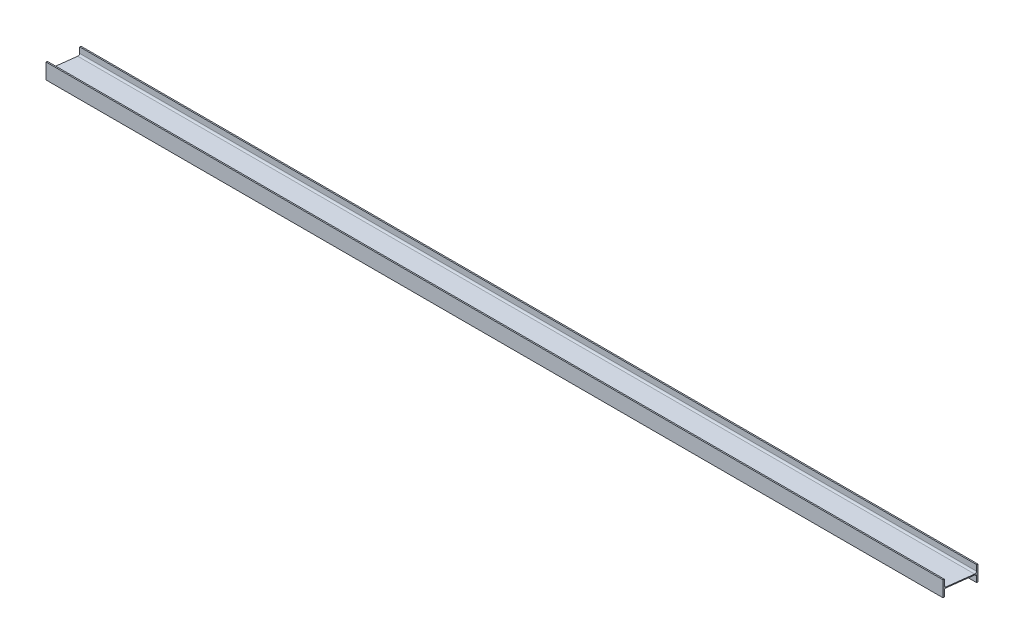
ISO-10303-21;
HEADER;
FILE_DESCRIPTION(('STEP AP214'),'2;1');
FILE_NAME('part.step','',(''),(''),'','','');
FILE_SCHEMA(('AUTOMOTIVE_DESIGN { 1 0 10303 214 1 1 1 1 }'));
ENDSEC;
DATA;
#1=APPLICATION_CONTEXT('core data for automotive mechanical design processes');
#2=APPLICATION_PROTOCOL_DEFINITION('international standard','automotive_design',2000,#1);
#3=PRODUCT_CONTEXT('',#1,'mechanical');
#4=PRODUCT('Part','Part','',(#3));
#5=PRODUCT_RELATED_PRODUCT_CATEGORY('part','',(#4));
#6=PRODUCT_DEFINITION_FORMATION('','',#4);
#7=PRODUCT_DEFINITION_CONTEXT('part definition',#1,'design');
#8=PRODUCT_DEFINITION('design','',#6,#7);
#9=PRODUCT_DEFINITION_SHAPE('','',#8);
#10=(LENGTH_UNIT() NAMED_UNIT(*) SI_UNIT(.MILLI.,.METRE.));
#11=(NAMED_UNIT(*) PLANE_ANGLE_UNIT() SI_UNIT($,.RADIAN.));
#12=(NAMED_UNIT(*) SI_UNIT($,.STERADIAN.) SOLID_ANGLE_UNIT());
#13=UNCERTAINTY_MEASURE_WITH_UNIT(LENGTH_MEASURE(1.E-05),#10,'distance_accuracy_value','');
#14=(GEOMETRIC_REPRESENTATION_CONTEXT(3) GLOBAL_UNCERTAINTY_ASSIGNED_CONTEXT((#13)) GLOBAL_UNIT_ASSIGNED_CONTEXT((#10,
#11,#12)) REPRESENTATION_CONTEXT('',''));
#15=CARTESIAN_POINT('',(0.,0.,0.));
#16=DIRECTION('',(0.,0.,1.));
#17=DIRECTION('',(1.,0.,0.));
#18=AXIS2_PLACEMENT_3D('',#15,#16,#17);
#19=CARTESIAN_POINT('',(5780.,13.7499999999998,-80.9999999999995));
#20=DIRECTION('',(-1.,0.,0.));
#21=DIRECTION('',(0.,0.,-1.));
#22=AXIS2_PLACEMENT_3D('',#19,#20,#21);
#23=CYLINDRICAL_SURFACE('',#22,11.);
#24=DIRECTION('',(-1.,0.,0.));
#25=VECTOR('',#24,1.);
#26=CARTESIAN_POINT('',(5780.,2.74999999999981,-80.9999999999995));
#27=LINE('',#26,#25);
#28=CARTESIAN_POINT('',(5777.625,2.74999999999981,-80.9999999999995));
#29=VERTEX_POINT('',#28);
#30=CARTESIAN_POINT('',(22.6249999999997,2.74999999999981,-80.9999999999995));
#31=VERTEX_POINT('',#30);
#32=EDGE_CURVE('E191',#29,#31,#27,.T.);
#33=ORIENTED_EDGE('',*,*,#32,.F.);
#34=CARTESIAN_POINT('',(5777.625,13.7499999999998,-80.9999999999995));
#35=DIRECTION('',(0.992277876713668,0.,0.12403473458921));
#36=DIRECTION('',(-0.12403473458921,0.,0.992277876713668));
#37=AXIS2_PLACEMENT_3D('',#34,#35,#36);
#38=ELLIPSE('',#37,11.0856044039105,11.);
#39=CARTESIAN_POINT('',(5779.,13.75,-92.0000000000005));
#40=VERTEX_POINT('',#39);
#41=EDGE_CURVE('E249',#40,#29,#38,.F.);
#42=ORIENTED_EDGE('',*,*,#41,.F.);
#43=DIRECTION('',(-1.,0.,0.));
#44=VECTOR('',#43,1.);
#45=CARTESIAN_POINT('',(5780.,13.75,-92.0000000000005));
#46=LINE('',#45,#44);
#47=CARTESIAN_POINT('',(24.,13.75,-92.0000000000005));
#48=VERTEX_POINT('',#47);
#49=EDGE_CURVE('E11',#40,#48,#46,.T.);
#50=ORIENTED_EDGE('',*,*,#49,.T.);
#51=CARTESIAN_POINT('',(22.6249999999997,13.7499999999998,-80.9999999999995));
#52=DIRECTION('',(-0.992277876713668,0.,-0.124034734589208));
#53=DIRECTION('',(-0.124034734589208,0.,0.992277876713668));
#54=AXIS2_PLACEMENT_3D('',#51,#52,#53);
#55=ELLIPSE('',#54,11.0856044039105,11.);
#56=EDGE_CURVE('E286',#31,#48,#55,.F.);
#57=ORIENTED_EDGE('',*,*,#56,.F.);
#58=EDGE_LOOP('',(#33,#42,#50,#57));
#59=FACE_BOUND('',#58,.T.);
#60=ADVANCED_FACE('F37',(#59),#23,.F.);
#61=CARTESIAN_POINT('',(5780.,50.,-92.0000000000005));
#62=DIRECTION('',(0.,0.,-1.));
#63=DIRECTION('',(0.,-1.,0.));
#64=AXIS2_PLACEMENT_3D('',#61,#62,#63);
#65=PLANE('',#64);
#66=ORIENTED_EDGE('',*,*,#49,.F.);
#67=DIRECTION('',(0.,-1.,0.));
#68=VECTOR('',#67,1.);
#69=CARTESIAN_POINT('',(5779.,50.,-92.0000000000005));
#70=LINE('',#69,#68);
#71=CARTESIAN_POINT('',(5779.,50.,-92.0000000000005));
#72=VERTEX_POINT('',#71);
#73=EDGE_CURVE('E252',#72,#40,#70,.T.);
#74=ORIENTED_EDGE('',*,*,#73,.F.);
#75=DIRECTION('',(-1.,0.,0.));
#76=VECTOR('',#75,1.);
#77=CARTESIAN_POINT('',(5780.,50.,-92.0000000000005));
#78=LINE('',#77,#76);
#79=CARTESIAN_POINT('',(24.,50.,-92.0000000000005));
#80=VERTEX_POINT('',#79);
#81=EDGE_CURVE('E46',#72,#80,#78,.T.);
#82=ORIENTED_EDGE('',*,*,#81,.T.);
#83=DIRECTION('',(0.,1.,0.));
#84=VECTOR('',#83,1.);
#85=CARTESIAN_POINT('',(24.,49.9999999999997,-92.0000000000005));
#86=LINE('',#85,#84);
#87=EDGE_CURVE('E163',#48,#80,#86,.T.);
#88=ORIENTED_EDGE('',*,*,#87,.F.);
#89=EDGE_LOOP('',(#66,#74,#82,#88));
#90=FACE_BOUND('',#89,.T.);
#91=ADVANCED_FACE('F337',(#90),#65,.F.);
#92=CARTESIAN_POINT('',(5780.,50.,-99.9999999999996));
#93=DIRECTION('',(0.,-1.,0.));
#94=DIRECTION('',(0.,0.,1.));
#95=AXIS2_PLACEMENT_3D('',#92,#93,#94);
#96=PLANE('',#95);
#97=ORIENTED_EDGE('',*,*,#81,.F.);
#98=DIRECTION('',(0.12403473458921,0.,-0.992277876713668));
#99=VECTOR('',#98,1.);
#100=CARTESIAN_POINT('',(5755.,50.,99.9999999999996));
#101=LINE('',#100,#99);
#102=CARTESIAN_POINT('',(5780.,50.,-99.9999999999996));
#103=VERTEX_POINT('',#102);
#104=EDGE_CURVE('E170',#72,#103,#101,.T.);
#105=ORIENTED_EDGE('',*,*,#104,.T.);
#106=DIRECTION('',(-1.,0.,0.));
#107=VECTOR('',#106,1.);
#108=CARTESIAN_POINT('',(5780.,50.,-99.9999999999996));
#109=LINE('',#108,#107);
#110=CARTESIAN_POINT('',(25.0000000000004,50.,-100.000000000001));
#111=VERTEX_POINT('',#110);
#112=EDGE_CURVE('E151',#103,#111,#109,.T.);
#113=ORIENTED_EDGE('',*,*,#112,.T.);
#114=DIRECTION('',(-0.124034734589208,0.,0.992277876713668));
#115=VECTOR('',#114,1.);
#116=CARTESIAN_POINT('',(0.,50.,99.9999999999996));
#117=LINE('',#116,#115);
#118=EDGE_CURVE('E158',#111,#80,#117,.T.);
#119=ORIENTED_EDGE('',*,*,#118,.T.);
#120=EDGE_LOOP('',(#97,#105,#113,#119));
#121=FACE_BOUND('',#120,.T.);
#122=ADVANCED_FACE('F169',(#121),#96,.F.);
#123=CARTESIAN_POINT('',(5780.,50.,-99.9999999999996));
#124=DIRECTION('',(0.,0.,1.));
#125=DIRECTION('',(0.,1.,0.));
#126=AXIS2_PLACEMENT_3D('',#123,#124,#125);
#127=PLANE('',#126);
#128=ORIENTED_EDGE('',*,*,#112,.F.);
#129=DIRECTION('',(0.,-1.,0.));
#130=VECTOR('',#129,1.);
#131=CARTESIAN_POINT('',(5780.,50.,-99.9999999999996));
#132=LINE('',#131,#130);
#133=CARTESIAN_POINT('',(5780.,-49.9999999999999,-99.9999999999996));
#134=VERTEX_POINT('',#133);
#135=EDGE_CURVE('E53',#103,#134,#132,.T.);
#136=ORIENTED_EDGE('',*,*,#135,.T.);
#137=DIRECTION('',(-1.,0.,0.));
#138=VECTOR('',#137,1.);
#139=CARTESIAN_POINT('',(5780.,-49.9999999999999,-99.9999999999996));
#140=LINE('',#139,#138);
#141=CARTESIAN_POINT('',(25.0000000000004,-49.9999999999999,-100.000000000001));
#142=VERTEX_POINT('',#141);
#143=EDGE_CURVE('E154',#134,#142,#140,.T.);
#144=ORIENTED_EDGE('',*,*,#143,.T.);
#145=DIRECTION('',(0.,1.,0.));
#146=VECTOR('',#145,1.);
#147=CARTESIAN_POINT('',(25.0000000000004,-50.000012,-100.000000000001));
#148=LINE('',#147,#146);
#149=EDGE_CURVE('E147',#142,#111,#148,.T.);
#150=ORIENTED_EDGE('',*,*,#149,.T.);
#151=EDGE_LOOP('',(#128,#136,#144,#150));
#152=FACE_BOUND('',#151,.T.);
#153=ADVANCED_FACE('F149',(#152),#127,.F.);
#154=CARTESIAN_POINT('',(5780.,-49.9999999999999,-99.9999999999996));
#155=DIRECTION('',(0.,1.,0.));
#156=DIRECTION('',(0.,0.,-1.));
#157=AXIS2_PLACEMENT_3D('',#154,#155,#156);
#158=PLANE('',#157);
#159=ORIENTED_EDGE('',*,*,#143,.F.);
#160=DIRECTION('',(0.12403473458921,0.,-0.992277876713668));
#161=VECTOR('',#160,1.);
#162=CARTESIAN_POINT('',(5780.,-49.9999999999999,-99.9999999999996));
#163=LINE('',#162,#161);
#164=CARTESIAN_POINT('',(5779.,-49.9999999999999,-92.0000000000005));
#165=VERTEX_POINT('',#164);
#166=EDGE_CURVE('E180',#165,#134,#163,.T.);
#167=ORIENTED_EDGE('',*,*,#166,.F.);
#168=DIRECTION('',(-1.,0.,0.));
#169=VECTOR('',#168,1.);
#170=CARTESIAN_POINT('',(5780.,-49.9999999999999,-92.0000000000005));
#171=LINE('',#170,#169);
#172=CARTESIAN_POINT('',(24.,-49.9999999999999,-92.0000000000005));
#173=VERTEX_POINT('',#172);
#174=EDGE_CURVE('E173',#165,#173,#171,.T.);
#175=ORIENTED_EDGE('',*,*,#174,.T.);
#176=DIRECTION('',(-0.124034734589208,0.,0.992277876713668));
#177=VECTOR('',#176,1.);
#178=CARTESIAN_POINT('',(113.538461538461,-50.,-808.307692307691));
#179=LINE('',#178,#177);
#180=EDGE_CURVE('E232',#142,#173,#179,.T.);
#181=ORIENTED_EDGE('',*,*,#180,.F.);
#182=EDGE_LOOP('',(#159,#167,#175,#181));
#183=FACE_BOUND('',#182,.T.);
#184=ADVANCED_FACE('F231',(#183),#158,.F.);
#185=CARTESIAN_POINT('',(5780.,-13.75,-92.0000000000005));
#186=DIRECTION('',(0.,0.,-1.));
#187=DIRECTION('',(1.,0.,0.));
#188=AXIS2_PLACEMENT_3D('',#185,#186,#187);
#189=PLANE('',#188);
#190=ORIENTED_EDGE('',*,*,#174,.F.);
#191=DIRECTION('',(0.,-1.,0.));
#192=VECTOR('',#191,1.);
#193=CARTESIAN_POINT('',(5779.,-13.75,-92.0000000000005));
#194=LINE('',#193,#192);
#195=CARTESIAN_POINT('',(5779.,-13.75,-92.0000000000005));
#196=VERTEX_POINT('',#195);
#197=EDGE_CURVE('E234',#196,#165,#194,.T.);
#198=ORIENTED_EDGE('',*,*,#197,.F.);
#199=DIRECTION('',(-1.,0.,0.));
#200=VECTOR('',#199,1.);
#201=CARTESIAN_POINT('',(5780.,-13.75,-92.0000000000005));
#202=LINE('',#201,#200);
#203=CARTESIAN_POINT('',(24.,-13.75,-92.0000000000005));
#204=VERTEX_POINT('',#203);
#205=EDGE_CURVE('E222',#196,#204,#202,.T.);
#206=ORIENTED_EDGE('',*,*,#205,.T.);
#207=DIRECTION('',(0.,1.,0.));
#208=VECTOR('',#207,1.);
#209=CARTESIAN_POINT('',(24.,-13.75,-92.0000000000005));
#210=LINE('',#209,#208);
#211=EDGE_CURVE('E236',#173,#204,#210,.T.);
#212=ORIENTED_EDGE('',*,*,#211,.F.);
#213=EDGE_LOOP('',(#190,#198,#206,#212));
#214=FACE_BOUND('',#213,.T.);
#215=ADVANCED_FACE('F233',(#214),#189,.F.);
#216=CARTESIAN_POINT('',(5780.,-13.7500000000003,-80.9999999999995));
#217=DIRECTION('',(-1.,0.,0.));
#218=DIRECTION('',(0.,0.,-1.));
#219=AXIS2_PLACEMENT_3D('',#216,#217,#218);
#220=CYLINDRICAL_SURFACE('',#219,11.);
#221=ORIENTED_EDGE('',*,*,#205,.F.);
#222=CARTESIAN_POINT('',(5777.625,-13.7500000000003,-80.9999999999995));
#223=DIRECTION('',(0.992277876713668,0.,0.12403473458921));
#224=DIRECTION('',(-0.12403473458921,0.,0.992277876713668));
#225=AXIS2_PLACEMENT_3D('',#222,#223,#224);
#226=ELLIPSE('',#225,11.0856044039105,11.);
#227=CARTESIAN_POINT('',(5777.625,-2.75000000000036,-80.9999999999995));
#228=VERTEX_POINT('',#227);
#229=EDGE_CURVE('E262',#228,#196,#226,.F.);
#230=ORIENTED_EDGE('',*,*,#229,.F.);
#231=DIRECTION('',(-1.,0.,0.));
#232=VECTOR('',#231,1.);
#233=CARTESIAN_POINT('',(5780.,-2.75000000000036,-80.9999999999995));
#234=LINE('',#233,#232);
#235=CARTESIAN_POINT('',(22.6249999999997,-2.75000000000036,-80.9999999999995));
#236=VERTEX_POINT('',#235);
#237=EDGE_CURVE('E220',#228,#236,#234,.T.);
#238=ORIENTED_EDGE('',*,*,#237,.T.);
#239=CARTESIAN_POINT('',(22.6249999999997,-13.7500000000003,-80.9999999999995));
#240=DIRECTION('',(-0.992277876713668,0.,-0.124034734589208));
#241=DIRECTION('',(-0.124034734589208,0.,0.992277876713668));
#242=AXIS2_PLACEMENT_3D('',#239,#240,#241);
#243=ELLIPSE('',#242,11.0856044039105,11.);
#244=EDGE_CURVE('E238',#204,#236,#243,.F.);
#245=ORIENTED_EDGE('',*,*,#244,.F.);
#246=EDGE_LOOP('',(#221,#230,#238,#245));
#247=FACE_BOUND('',#246,.T.);
#248=ADVANCED_FACE('F269',(#247),#220,.F.);
#249=CARTESIAN_POINT('',(5780.,-2.75000000000036,-80.9999999999995));
#250=DIRECTION('',(0.,1.,0.));
#251=DIRECTION('',(0.,0.,-1.));
#252=AXIS2_PLACEMENT_3D('',#249,#250,#251);
#253=PLANE('',#252);
#254=ORIENTED_EDGE('',*,*,#237,.F.);
#255=DIRECTION('',(0.12403473458921,0.,-0.992277876713668));
#256=VECTOR('',#255,1.);
#257=CARTESIAN_POINT('',(5777.66153846154,-2.75000000000036,-81.2923076923084));
#258=LINE('',#257,#256);
#259=CARTESIAN_POINT('',(5757.375,-2.75000000000003,80.9999999999995));
#260=VERTEX_POINT('',#259);
#261=EDGE_CURVE('E260',#260,#228,#258,.T.);
#262=ORIENTED_EDGE('',*,*,#261,.F.);
#263=DIRECTION('',(-1.,0.,0.));
#264=VECTOR('',#263,1.);
#265=CARTESIAN_POINT('',(5780.,-2.75000000000003,80.9999999999995));
#266=LINE('',#265,#264);
#267=CARTESIAN_POINT('',(2.37499999999979,-2.75000000000003,80.9999999999995));
#268=VERTEX_POINT('',#267);
#269=EDGE_CURVE('E217',#260,#268,#266,.T.);
#270=ORIENTED_EDGE('',*,*,#269,.T.);
#271=DIRECTION('',(-0.124034734589208,0.,0.992277876713668));
#272=VECTOR('',#271,1.);
#273=CARTESIAN_POINT('',(111.199999999999,-2.75000000000003,-789.6));
#274=LINE('',#273,#272);
#275=EDGE_CURVE('E271',#236,#268,#274,.T.);
#276=ORIENTED_EDGE('',*,*,#275,.F.);
#277=EDGE_LOOP('',(#254,#262,#270,#276));
#278=FACE_BOUND('',#277,.T.);
#279=ADVANCED_FACE('F321',(#278),#253,.F.);
#280=CARTESIAN_POINT('',(5780.,-13.75,80.9999999999995));
#281=DIRECTION('',(-1.,0.,0.));
#282=DIRECTION('',(0.,0.,-1.));
#283=AXIS2_PLACEMENT_3D('',#280,#281,#282);
#284=CYLINDRICAL_SURFACE('',#283,11.);
#285=ORIENTED_EDGE('',*,*,#269,.F.);
#286=CARTESIAN_POINT('',(5757.375,-13.75,80.9999999999995));
#287=DIRECTION('',(0.992277876713668,0.,0.12403473458921));
#288=DIRECTION('',(-0.12403473458921,0.,0.992277876713668));
#289=AXIS2_PLACEMENT_3D('',#286,#287,#288);
#290=ELLIPSE('',#289,11.0856044039105,11.);
#291=CARTESIAN_POINT('',(5756.,-13.75,92.0000000000005));
#292=VERTEX_POINT('',#291);
#293=EDGE_CURVE('E258',#292,#260,#290,.F.);
#294=ORIENTED_EDGE('',*,*,#293,.F.);
#295=DIRECTION('',(-1.,0.,0.));
#296=VECTOR('',#295,1.);
#297=CARTESIAN_POINT('',(5780.,-13.75,92.0000000000005));
#298=LINE('',#297,#296);
#299=CARTESIAN_POINT('',(1.00000000000033,-13.75,92.0000000000005));
#300=VERTEX_POINT('',#299);
#301=EDGE_CURVE('E214',#292,#300,#298,.T.);
#302=ORIENTED_EDGE('',*,*,#301,.T.);
#303=CARTESIAN_POINT('',(2.37499999999979,-13.75,80.9999999999995));
#304=DIRECTION('',(-0.992277876713668,0.,-0.124034734589208));
#305=DIRECTION('',(-0.124034734589208,0.,0.992277876713668));
#306=AXIS2_PLACEMENT_3D('',#303,#304,#305);
#307=ELLIPSE('',#306,11.0856044039105,11.);
#308=EDGE_CURVE('E272',#268,#300,#307,.F.);
#309=ORIENTED_EDGE('',*,*,#308,.F.);
#310=EDGE_LOOP('',(#285,#294,#302,#309));
#311=FACE_BOUND('',#310,.T.);
#312=ADVANCED_FACE('F319',(#311),#284,.F.);
#313=CARTESIAN_POINT('',(5780.,-13.75,92.0000000000005));
#314=DIRECTION('',(0.,0.,1.));
#315=DIRECTION('',(-1.,0.,0.));
#316=AXIS2_PLACEMENT_3D('',#313,#314,#315);
#317=PLANE('',#316);
#318=ORIENTED_EDGE('',*,*,#301,.F.);
#319=DIRECTION('',(0.,1.,0.));
#320=VECTOR('',#319,1.);
#321=CARTESIAN_POINT('',(5756.,-13.75,92.0000000000005));
#322=LINE('',#321,#320);
#323=CARTESIAN_POINT('',(5756.,-49.9999999999999,92.0000000000005));
#324=VERTEX_POINT('',#323);
#325=EDGE_CURVE('E256',#324,#292,#322,.T.);
#326=ORIENTED_EDGE('',*,*,#325,.F.);
#327=DIRECTION('',(-1.,0.,0.));
#328=VECTOR('',#327,1.);
#329=CARTESIAN_POINT('',(5780.,-49.9999999999999,92.0000000000005));
#330=LINE('',#329,#328);
#331=CARTESIAN_POINT('',(1.00000000000033,-49.9999999999999,92.0000000000005));
#332=VERTEX_POINT('',#331);
#333=EDGE_CURVE('E186',#324,#332,#330,.T.);
#334=ORIENTED_EDGE('',*,*,#333,.T.);
#335=DIRECTION('',(0.,-1.,0.));
#336=VECTOR('',#335,1.);
#337=CARTESIAN_POINT('',(1.00000000000033,-13.75,92.0000000000005));
#338=LINE('',#337,#336);
#339=EDGE_CURVE('E277',#300,#332,#338,.T.);
#340=ORIENTED_EDGE('',*,*,#339,.F.);
#341=EDGE_LOOP('',(#318,#326,#334,#340));
#342=FACE_BOUND('',#341,.T.);
#343=ADVANCED_FACE('F317',(#342),#317,.F.);
#344=CARTESIAN_POINT('',(5780.,-49.9999999999999,92.0000000000005));
#345=DIRECTION('',(0.,1.,0.));
#346=DIRECTION('',(0.,0.,-1.));
#347=AXIS2_PLACEMENT_3D('',#344,#345,#346);
#348=PLANE('',#347);
#349=ORIENTED_EDGE('',*,*,#333,.F.);
#350=DIRECTION('',(0.12403473458921,0.,-0.992277876713668));
#351=VECTOR('',#350,1.);
#352=CARTESIAN_POINT('',(5756.36923076923,-50.,89.0461538461533));
#353=LINE('',#352,#351);
#354=CARTESIAN_POINT('',(5755.,-49.9999999999999,99.9999999999996));
#355=VERTEX_POINT('',#354);
#356=EDGE_CURVE('E254',#355,#324,#353,.T.);
#357=ORIENTED_EDGE('',*,*,#356,.F.);
#358=DIRECTION('',(-1.,0.,0.));
#359=VECTOR('',#358,1.);
#360=CARTESIAN_POINT('',(5780.,-49.9999999999999,99.9999999999996));
#361=LINE('',#360,#359);
#362=CARTESIAN_POINT('',(0.,-49.9999999999999,99.9999999999996));
#363=VERTEX_POINT('',#362);
#364=EDGE_CURVE('E183',#355,#363,#361,.T.);
#365=ORIENTED_EDGE('',*,*,#364,.T.);
#366=DIRECTION('',(-0.124034734589208,0.,0.992277876713668));
#367=VECTOR('',#366,1.);
#368=CARTESIAN_POINT('',(89.9076923076922,-50.0000000000002,-619.261538461538));
#369=LINE('',#368,#367);
#370=EDGE_CURVE('E280',#332,#363,#369,.T.);
#371=ORIENTED_EDGE('',*,*,#370,.F.);
#372=EDGE_LOOP('',(#349,#357,#365,#371));
#373=FACE_BOUND('',#372,.T.);
#374=ADVANCED_FACE('F311',(#373),#348,.F.);
#375=CARTESIAN_POINT('',(5780.,50.,99.9999999999996));
#376=DIRECTION('',(0.,0.,-1.));
#377=DIRECTION('',(0.,-1.,0.));
#378=AXIS2_PLACEMENT_3D('',#375,#376,#377);
#379=PLANE('',#378);
#380=DIRECTION('',(-1.,0.,0.));
#381=VECTOR('',#380,1.);
#382=CARTESIAN_POINT('',(5780.,50.,99.9999999999996));
#383=LINE('',#382,#381);
#384=CARTESIAN_POINT('',(5755.,50.,99.9999999999996));
#385=VERTEX_POINT('',#384);
#386=CARTESIAN_POINT('',(0.,50.,99.9999999999996));
#387=VERTEX_POINT('',#386);
#388=EDGE_CURVE('E187',#385,#387,#383,.T.);
#389=ORIENTED_EDGE('',*,*,#388,.T.);
#390=DIRECTION('',(0.,1.,0.));
#391=VECTOR('',#390,1.);
#392=CARTESIAN_POINT('',(0.,50.,99.9999999999996));
#393=LINE('',#392,#391);
#394=EDGE_CURVE('E177',#363,#387,#393,.T.);
#395=ORIENTED_EDGE('',*,*,#394,.F.);
#396=ORIENTED_EDGE('',*,*,#364,.F.);
#397=DIRECTION('',(0.,1.,0.));
#398=VECTOR('',#397,1.);
#399=CARTESIAN_POINT('',(5755.,-50.0000119999999,99.9999999999996));
#400=LINE('',#399,#398);
#401=EDGE_CURVE('E295',#355,#385,#400,.T.);
#402=ORIENTED_EDGE('',*,*,#401,.T.);
#403=EDGE_LOOP('',(#389,#395,#396,#402));
#404=FACE_BOUND('',#403,.T.);
#405=ADVANCED_FACE('F307',(#404),#379,.F.);
#406=CARTESIAN_POINT('',(5780.,50.,92.0000000000005));
#407=DIRECTION('',(0.,-1.,0.));
#408=DIRECTION('',(0.,0.,1.));
#409=AXIS2_PLACEMENT_3D('',#406,#407,#408);
#410=PLANE('',#409);
#411=ORIENTED_EDGE('',*,*,#388,.F.);
#412=CARTESIAN_POINT('',(5756.,50.,92.0000000000005));
#413=VERTEX_POINT('',#412);
#414=EDGE_CURVE('E298',#385,#413,#101,.T.);
#415=ORIENTED_EDGE('',*,*,#414,.T.);
#416=DIRECTION('',(-1.,0.,0.));
#417=VECTOR('',#416,1.);
#418=CARTESIAN_POINT('',(5780.,50.,92.0000000000005));
#419=LINE('',#418,#417);
#420=CARTESIAN_POINT('',(1.00000000000033,50.,92.0000000000005));
#421=VERTEX_POINT('',#420);
#422=EDGE_CURVE('E207',#413,#421,#419,.T.);
#423=ORIENTED_EDGE('',*,*,#422,.T.);
#424=EDGE_CURVE('E167',#421,#387,#117,.T.);
#425=ORIENTED_EDGE('',*,*,#424,.T.);
#426=EDGE_LOOP('',(#411,#415,#423,#425));
#427=FACE_BOUND('',#426,.T.);
#428=ADVANCED_FACE('F302',(#427),#410,.F.);
#429=CARTESIAN_POINT('',(5780.,50.,92.0000000000005));
#430=DIRECTION('',(0.,0.,1.));
#431=DIRECTION('',(0.,1.,0.));
#432=AXIS2_PLACEMENT_3D('',#429,#430,#431);
#433=PLANE('',#432);
#434=ORIENTED_EDGE('',*,*,#422,.F.);
#435=DIRECTION('',(0.,1.,0.));
#436=VECTOR('',#435,1.);
#437=CARTESIAN_POINT('',(5756.,50.,92.0000000000005));
#438=LINE('',#437,#436);
#439=CARTESIAN_POINT('',(5756.,13.75,92.0000000000005));
#440=VERTEX_POINT('',#439);
#441=EDGE_CURVE('E247',#440,#413,#438,.T.);
#442=ORIENTED_EDGE('',*,*,#441,.F.);
#443=DIRECTION('',(-1.,0.,0.));
#444=VECTOR('',#443,1.);
#445=CARTESIAN_POINT('',(5780.,13.75,92.0000000000005));
#446=LINE('',#445,#444);
#447=CARTESIAN_POINT('',(0.999999999999446,13.75,92.0000000000005));
#448=VERTEX_POINT('',#447);
#449=EDGE_CURVE('E199',#440,#448,#446,.T.);
#450=ORIENTED_EDGE('',*,*,#449,.T.);
#451=DIRECTION('',(0.,-1.,0.));
#452=VECTOR('',#451,1.);
#453=CARTESIAN_POINT('',(1.00000000000033,50.0000000000003,92.0000000000005));
#454=LINE('',#453,#452);
#455=EDGE_CURVE('E288',#421,#448,#454,.T.);
#456=ORIENTED_EDGE('',*,*,#455,.F.);
#457=EDGE_LOOP('',(#434,#442,#450,#456));
#458=FACE_BOUND('',#457,.T.);
#459=ADVANCED_FACE('F325',(#458),#433,.F.);
#460=CARTESIAN_POINT('',(5780.,13.75,80.9999999999995));
#461=DIRECTION('',(-1.,0.,0.));
#462=DIRECTION('',(0.,0.,-1.));
#463=AXIS2_PLACEMENT_3D('',#460,#461,#462);
#464=CYLINDRICAL_SURFACE('',#463,11.);
#465=ORIENTED_EDGE('',*,*,#449,.F.);
#466=CARTESIAN_POINT('',(5757.375,13.75,80.9999999999995));
#467=DIRECTION('',(0.992277876713668,0.,0.12403473458921));
#468=DIRECTION('',(-0.12403473458921,0.,0.992277876713668));
#469=AXIS2_PLACEMENT_3D('',#466,#467,#468);
#470=ELLIPSE('',#469,11.0856044039105,11.);
#471=CARTESIAN_POINT('',(5757.375,2.75000000000003,80.9999999999995));
#472=VERTEX_POINT('',#471);
#473=EDGE_CURVE('E242',#472,#440,#470,.F.);
#474=ORIENTED_EDGE('',*,*,#473,.F.);
#475=DIRECTION('',(-1.,0.,0.));
#476=VECTOR('',#475,1.);
#477=CARTESIAN_POINT('',(5780.,2.75000000000003,80.9999999999995));
#478=LINE('',#477,#476);
#479=CARTESIAN_POINT('',(2.37499999999891,2.75000000000003,80.9999999999995));
#480=VERTEX_POINT('',#479);
#481=EDGE_CURVE('E194',#472,#480,#478,.T.);
#482=ORIENTED_EDGE('',*,*,#481,.T.);
#483=CARTESIAN_POINT('',(2.37499999999979,13.75,80.9999999999995));
#484=DIRECTION('',(-0.992277876713668,0.,-0.124034734589208));
#485=DIRECTION('',(-0.124034734589208,0.,0.992277876713668));
#486=AXIS2_PLACEMENT_3D('',#483,#484,#485);
#487=ELLIPSE('',#486,11.0856044039105,11.);
#488=EDGE_CURVE('E291',#448,#480,#487,.F.);
#489=ORIENTED_EDGE('',*,*,#488,.F.);
#490=EDGE_LOOP('',(#465,#474,#482,#489));
#491=FACE_BOUND('',#490,.T.);
#492=ADVANCED_FACE('F328',(#491),#464,.F.);
#493=CARTESIAN_POINT('',(5780.,2.74999999999981,-80.9999999999995));
#494=DIRECTION('',(0.,-1.,0.));
#495=DIRECTION('',(0.,0.,1.));
#496=AXIS2_PLACEMENT_3D('',#493,#494,#495);
#497=PLANE('',#496);
#498=ORIENTED_EDGE('',*,*,#481,.F.);
#499=DIRECTION('',(-0.12403473458921,0.,0.992277876713668));
#500=VECTOR('',#499,1.);
#501=CARTESIAN_POINT('',(5777.66153846154,2.74999999999981,-81.2923076923084));
#502=LINE('',#501,#500);
#503=EDGE_CURVE('E240',#29,#472,#502,.T.);
#504=ORIENTED_EDGE('',*,*,#503,.F.);
#505=ORIENTED_EDGE('',*,*,#32,.T.);
#506=DIRECTION('',(0.124034734589208,0.,-0.992277876713668));
#507=VECTOR('',#506,1.);
#508=CARTESIAN_POINT('',(111.199999999999,2.74999999999992,-789.6));
#509=LINE('',#508,#507);
#510=EDGE_CURVE('E157',#480,#31,#509,.T.);
#511=ORIENTED_EDGE('',*,*,#510,.F.);
#512=EDGE_LOOP('',(#498,#504,#505,#511));
#513=FACE_BOUND('',#512,.T.);
#514=ADVANCED_FACE('F330',(#513),#497,.F.);
#515=CARTESIAN_POINT('',(0.,-50.0000119999999,99.9999999999996));
#516=DIRECTION('',(0.992277876713668,0.,0.124034734589208));
#517=DIRECTION('',(-0.124034734589208,0.,0.992277876713668));
#518=AXIS2_PLACEMENT_3D('',#515,#516,#517);
#519=PLANE('',#518);
#520=ORIENTED_EDGE('',*,*,#149,.F.);
#521=ORIENTED_EDGE('',*,*,#180,.T.);
#522=ORIENTED_EDGE('',*,*,#211,.T.);
#523=ORIENTED_EDGE('',*,*,#244,.T.);
#524=ORIENTED_EDGE('',*,*,#275,.T.);
#525=ORIENTED_EDGE('',*,*,#308,.T.);
#526=ORIENTED_EDGE('',*,*,#339,.T.);
#527=ORIENTED_EDGE('',*,*,#370,.T.);
#528=ORIENTED_EDGE('',*,*,#394,.T.);
#529=ORIENTED_EDGE('',*,*,#424,.F.);
#530=ORIENTED_EDGE('',*,*,#455,.T.);
#531=ORIENTED_EDGE('',*,*,#488,.T.);
#532=ORIENTED_EDGE('',*,*,#510,.T.);
#533=ORIENTED_EDGE('',*,*,#56,.T.);
#534=ORIENTED_EDGE('',*,*,#87,.T.);
#535=ORIENTED_EDGE('',*,*,#118,.F.);
#536=EDGE_LOOP('',(#520,#521,#522,#523,#524,#525,#526,#527,#528,#529,#530,#531,#532,#533,#534,#535));
#537=FACE_BOUND('',#536,.T.);
#538=ADVANCED_FACE('F161',(#537),#519,.F.);
#539=CARTESIAN_POINT('',(5755.,-50.0000119999999,99.9999999999996));
#540=DIRECTION('',(-0.992277876713668,0.,-0.12403473458921));
#541=DIRECTION('',(0.12403473458921,0.,-0.992277876713668));
#542=AXIS2_PLACEMENT_3D('',#539,#540,#541);
#543=PLANE('',#542);
#544=ORIENTED_EDGE('',*,*,#197,.T.);
#545=ORIENTED_EDGE('',*,*,#166,.T.);
#546=ORIENTED_EDGE('',*,*,#135,.F.);
#547=ORIENTED_EDGE('',*,*,#104,.F.);
#548=ORIENTED_EDGE('',*,*,#73,.T.);
#549=ORIENTED_EDGE('',*,*,#41,.T.);
#550=ORIENTED_EDGE('',*,*,#503,.T.);
#551=ORIENTED_EDGE('',*,*,#473,.T.);
#552=ORIENTED_EDGE('',*,*,#441,.T.);
#553=ORIENTED_EDGE('',*,*,#414,.F.);
#554=ORIENTED_EDGE('',*,*,#401,.F.);
#555=ORIENTED_EDGE('',*,*,#356,.T.);
#556=ORIENTED_EDGE('',*,*,#325,.T.);
#557=ORIENTED_EDGE('',*,*,#293,.T.);
#558=ORIENTED_EDGE('',*,*,#261,.T.);
#559=ORIENTED_EDGE('',*,*,#229,.T.);
#560=EDGE_LOOP('',(#544,#545,#546,#547,#548,#549,#550,#551,#552,#553,#554,#555,#556,#557,#558,#559));
#561=FACE_BOUND('',#560,.T.);
#562=ADVANCED_FACE('F264',(#561),#543,.F.);
#563=CLOSED_SHELL('',(#60,#91,#122,#153,#184,#215,#248,#279,#312,#343,#374,#405,#428,#459,#492,
#514,#538,#562));
#564=MANIFOLD_SOLID_BREP('B2',#563);
#565=ADVANCED_BREP_SHAPE_REPRESENTATION('',(#18,#564),#14);
#566=SHAPE_DEFINITION_REPRESENTATION(#9,#565);
ENDSEC;
END-ISO-10303-21;
